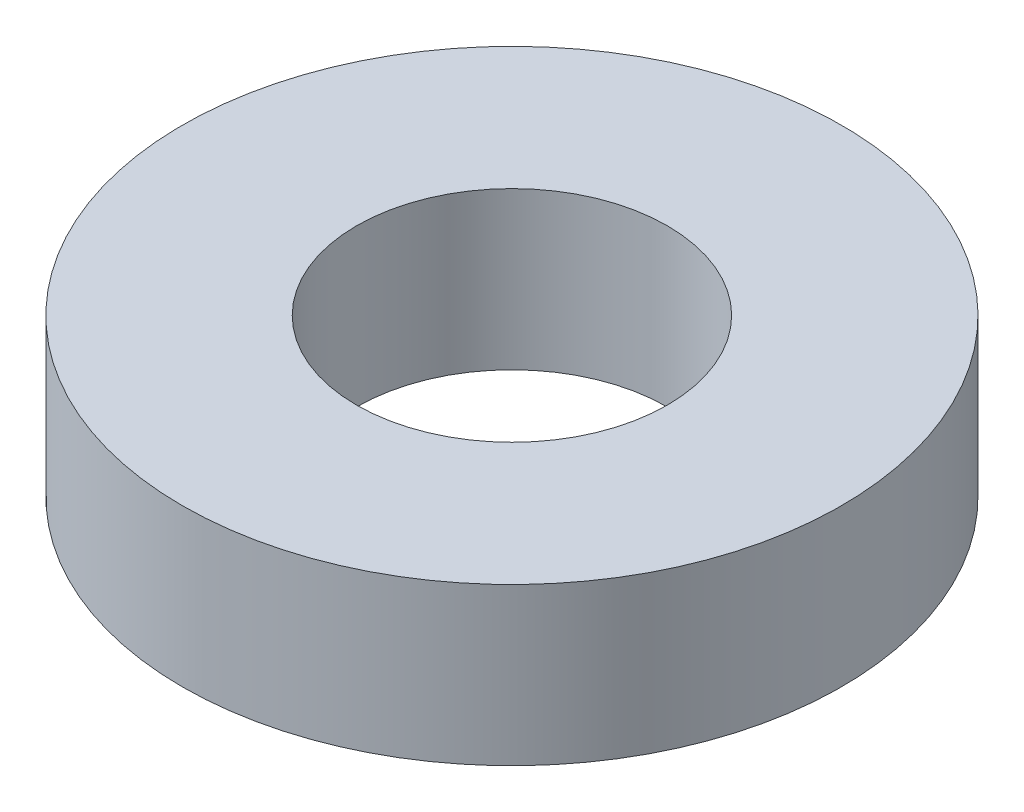
ISO-10303-21;
HEADER;
FILE_DESCRIPTION(('STEP AP214'),'2;1');
FILE_NAME('part.step','',(''),(''),'','','');
FILE_SCHEMA(('AUTOMOTIVE_DESIGN { 1 0 10303 214 1 1 1 1 }'));
ENDSEC;
DATA;
#1=APPLICATION_CONTEXT('core data for automotive mechanical design processes');
#2=APPLICATION_PROTOCOL_DEFINITION('international standard','automotive_design',2000,#1);
#3=PRODUCT_CONTEXT('',#1,'mechanical');
#4=PRODUCT('Part','Part','',(#3));
#5=PRODUCT_RELATED_PRODUCT_CATEGORY('part','',(#4));
#6=PRODUCT_DEFINITION_FORMATION('','',#4);
#7=PRODUCT_DEFINITION_CONTEXT('part definition',#1,'design');
#8=PRODUCT_DEFINITION('design','',#6,#7);
#9=PRODUCT_DEFINITION_SHAPE('','',#8);
#10=(LENGTH_UNIT() NAMED_UNIT(*) SI_UNIT(.MILLI.,.METRE.));
#11=(NAMED_UNIT(*) PLANE_ANGLE_UNIT() SI_UNIT($,.RADIAN.));
#12=(NAMED_UNIT(*) SI_UNIT($,.STERADIAN.) SOLID_ANGLE_UNIT());
#13=UNCERTAINTY_MEASURE_WITH_UNIT(LENGTH_MEASURE(1.E-05),#10,'distance_accuracy_value','');
#14=(GEOMETRIC_REPRESENTATION_CONTEXT(3) GLOBAL_UNCERTAINTY_ASSIGNED_CONTEXT((#13)) GLOBAL_UNIT_ASSIGNED_CONTEXT((#10,
#11,#12)) REPRESENTATION_CONTEXT('',''));
#15=CARTESIAN_POINT('',(0.,0.,0.));
#16=DIRECTION('',(0.,0.,1.));
#17=DIRECTION('',(1.,0.,0.));
#18=AXIS2_PLACEMENT_3D('',#15,#16,#17);
#19=CARTESIAN_POINT('',(0.,5.,0.));
#20=DIRECTION('',(0.,1.,0.));
#21=DIRECTION('',(0.,0.,1.));
#22=AXIS2_PLACEMENT_3D('',#19,#20,#21);
#23=PLANE('',#22);
#24=CARTESIAN_POINT('',(0.,5.,0.));
#25=DIRECTION('',(0.,1.,0.));
#26=DIRECTION('',(0.,0.,1.));
#27=AXIS2_PLACEMENT_3D('',#24,#25,#26);
#28=CIRCLE('',#27,10.5);
#29=CARTESIAN_POINT('',(0.,5.,10.5));
#30=VERTEX_POINT('',#29);
#31=EDGE_CURVE('E10',#30,#30,#28,.T.);
#32=ORIENTED_EDGE('',*,*,#31,.T.);
#33=EDGE_LOOP('',(#32));
#34=FACE_BOUND('',#33,.T.);
#35=CARTESIAN_POINT('',(0.,5.,0.));
#36=DIRECTION('',(0.,1.,0.));
#37=DIRECTION('',(0.,0.,1.));
#38=AXIS2_PLACEMENT_3D('',#35,#36,#37);
#39=CIRCLE('',#38,4.95);
#40=CARTESIAN_POINT('',(0.,5.,4.95));
#41=VERTEX_POINT('',#40);
#42=EDGE_CURVE('E42',#41,#41,#39,.T.);
#43=ORIENTED_EDGE('',*,*,#42,.F.);
#44=EDGE_LOOP('',(#43));
#45=FACE_BOUND('',#44,.T.);
#46=ADVANCED_FACE('F31',(#34,#45),#23,.T.);
#47=CARTESIAN_POINT('',(0.,0.,0.));
#48=DIRECTION('',(0.,1.,0.));
#49=DIRECTION('',(0.,0.,1.));
#50=AXIS2_PLACEMENT_3D('',#47,#48,#49);
#51=PLANE('',#50);
#52=CARTESIAN_POINT('',(0.,0.,0.));
#53=DIRECTION('',(0.,1.,0.));
#54=DIRECTION('',(0.,0.,1.));
#55=AXIS2_PLACEMENT_3D('',#52,#53,#54);
#56=CIRCLE('',#55,10.5);
#57=CARTESIAN_POINT('',(0.,0.,10.5));
#58=VERTEX_POINT('',#57);
#59=EDGE_CURVE('E35',#58,#58,#56,.T.);
#60=ORIENTED_EDGE('',*,*,#59,.F.);
#61=EDGE_LOOP('',(#60));
#62=FACE_BOUND('',#61,.T.);
#63=CARTESIAN_POINT('',(0.,0.,0.));
#64=DIRECTION('',(0.,1.,0.));
#65=DIRECTION('',(0.,0.,1.));
#66=AXIS2_PLACEMENT_3D('',#63,#64,#65);
#67=CIRCLE('',#66,4.95);
#68=CARTESIAN_POINT('',(0.,0.,4.95));
#69=VERTEX_POINT('',#68);
#70=EDGE_CURVE('E44',#69,#69,#67,.T.);
#71=ORIENTED_EDGE('',*,*,#70,.T.);
#72=EDGE_LOOP('',(#71));
#73=FACE_BOUND('',#72,.T.);
#74=ADVANCED_FACE('F54',(#62,#73),#51,.F.);
#75=CARTESIAN_POINT('',(0.,5.,0.));
#76=DIRECTION('',(0.,-1.,0.));
#77=DIRECTION('',(0.,0.,-1.));
#78=AXIS2_PLACEMENT_3D('',#75,#76,#77);
#79=CYLINDRICAL_SURFACE('',#78,10.5);
#80=ORIENTED_EDGE('',*,*,#31,.F.);
#81=EDGE_LOOP('',(#80));
#82=FACE_BOUND('',#81,.T.);
#83=ORIENTED_EDGE('',*,*,#59,.T.);
#84=EDGE_LOOP('',(#83));
#85=FACE_BOUND('',#84,.T.);
#86=ADVANCED_FACE('F33',(#82,#85),#79,.T.);
#87=CARTESIAN_POINT('',(0.,5.,0.));
#88=DIRECTION('',(0.,-1.,0.));
#89=DIRECTION('',(0.,0.,-1.));
#90=AXIS2_PLACEMENT_3D('',#87,#88,#89);
#91=CYLINDRICAL_SURFACE('',#90,4.95);
#92=ORIENTED_EDGE('',*,*,#42,.T.);
#93=EDGE_LOOP('',(#92));
#94=FACE_BOUND('',#93,.T.);
#95=ORIENTED_EDGE('',*,*,#70,.F.);
#96=EDGE_LOOP('',(#95));
#97=FACE_BOUND('',#96,.T.);
#98=ADVANCED_FACE('F50',(#94,#97),#91,.F.);
#99=CLOSED_SHELL('',(#46,#74,#86,#98));
#100=MANIFOLD_SOLID_BREP('B2',#99);
#101=ADVANCED_BREP_SHAPE_REPRESENTATION('',(#18,#100),#14);
#102=SHAPE_DEFINITION_REPRESENTATION(#9,#101);
ENDSEC;
END-ISO-10303-21;
